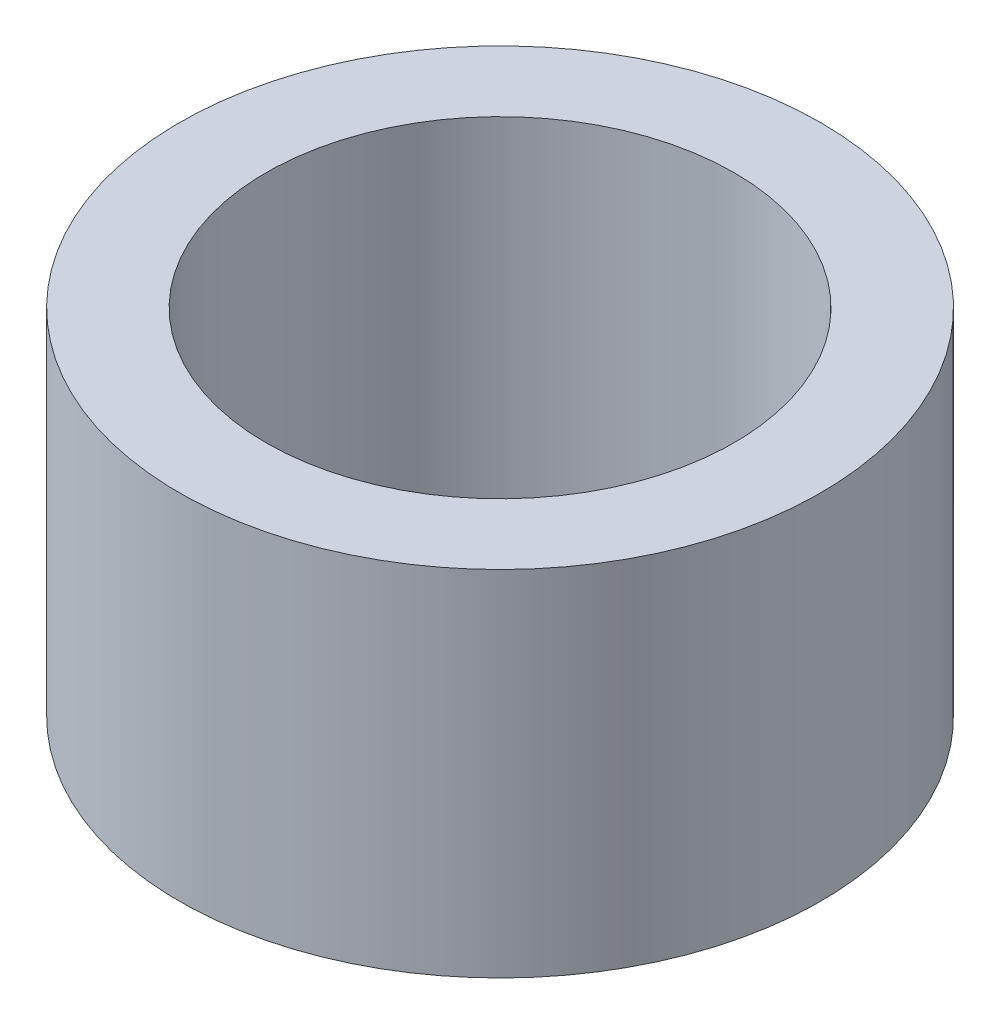
ISO-10303-21;
HEADER;
FILE_DESCRIPTION(('STEP AP214'),'2;1');
FILE_NAME('part.step','',(''),(''),'','','');
FILE_SCHEMA(('AUTOMOTIVE_DESIGN { 1 0 10303 214 1 1 1 1 }'));
ENDSEC;
DATA;
#1=APPLICATION_CONTEXT('core data for automotive mechanical design processes');
#2=APPLICATION_PROTOCOL_DEFINITION('international standard','automotive_design',2000,#1);
#3=PRODUCT_CONTEXT('',#1,'mechanical');
#4=PRODUCT('Part','Part','',(#3));
#5=PRODUCT_RELATED_PRODUCT_CATEGORY('part','',(#4));
#6=PRODUCT_DEFINITION_FORMATION('','',#4);
#7=PRODUCT_DEFINITION_CONTEXT('part definition',#1,'design');
#8=PRODUCT_DEFINITION('design','',#6,#7);
#9=PRODUCT_DEFINITION_SHAPE('','',#8);
#10=(LENGTH_UNIT() NAMED_UNIT(*) SI_UNIT(.MILLI.,.METRE.));
#11=(NAMED_UNIT(*) PLANE_ANGLE_UNIT() SI_UNIT($,.RADIAN.));
#12=(NAMED_UNIT(*) SI_UNIT($,.STERADIAN.) SOLID_ANGLE_UNIT());
#13=UNCERTAINTY_MEASURE_WITH_UNIT(LENGTH_MEASURE(1.E-05),#10,'distance_accuracy_value','');
#14=(GEOMETRIC_REPRESENTATION_CONTEXT(3) GLOBAL_UNCERTAINTY_ASSIGNED_CONTEXT((#13)) GLOBAL_UNIT_ASSIGNED_CONTEXT((#10,
#11,#12)) REPRESENTATION_CONTEXT('',''));
#15=CARTESIAN_POINT('',(0.,0.,0.));
#16=DIRECTION('',(0.,0.,1.));
#17=DIRECTION('',(1.,0.,0.));
#18=AXIS2_PLACEMENT_3D('',#15,#16,#17);
#19=CARTESIAN_POINT('',(0.,4.5593,0.));
#20=DIRECTION('',(0.,1.,0.));
#21=DIRECTION('',(0.,0.,1.));
#22=AXIS2_PLACEMENT_3D('',#19,#20,#21);
#23=PLANE('',#22);
#24=CARTESIAN_POINT('',(0.,4.5593,0.));
#25=DIRECTION('',(0.,1.,0.));
#26=DIRECTION('',(0.,0.,1.));
#27=AXIS2_PLACEMENT_3D('',#24,#25,#26);
#28=CIRCLE('',#27,4.13258);
#29=CARTESIAN_POINT('',(0.,4.5593,-4.13258));
#30=VERTEX_POINT('',#29);
#31=EDGE_CURVE('E10',#30,#30,#28,.T.);
#32=ORIENTED_EDGE('',*,*,#31,.T.);
#33=EDGE_LOOP('',(#32));
#34=FACE_BOUND('',#33,.T.);
#35=CARTESIAN_POINT('',(0.,4.5593,0.));
#36=DIRECTION('',(0.,1.,0.));
#37=DIRECTION('',(0.,0.,1.));
#38=AXIS2_PLACEMENT_3D('',#35,#36,#37);
#39=CIRCLE('',#38,3.01625);
#40=CARTESIAN_POINT('',(0.,4.5593,-3.01625));
#41=VERTEX_POINT('',#40);
#42=EDGE_CURVE('E43',#41,#41,#39,.T.);
#43=ORIENTED_EDGE('',*,*,#42,.F.);
#44=EDGE_LOOP('',(#43));
#45=FACE_BOUND('',#44,.T.);
#46=ADVANCED_FACE('F32',(#34,#45),#23,.T.);
#47=CARTESIAN_POINT('',(0.,0.,0.));
#48=DIRECTION('',(0.,1.,0.));
#49=DIRECTION('',(0.,0.,1.));
#50=AXIS2_PLACEMENT_3D('',#47,#48,#49);
#51=PLANE('',#50);
#52=CARTESIAN_POINT('',(0.,0.,0.));
#53=DIRECTION('',(0.,1.,0.));
#54=DIRECTION('',(0.,0.,1.));
#55=AXIS2_PLACEMENT_3D('',#52,#53,#54);
#56=CIRCLE('',#55,4.13258);
#57=CARTESIAN_POINT('',(0.,0.,-4.13258));
#58=VERTEX_POINT('',#57);
#59=EDGE_CURVE('E36',#58,#58,#56,.T.);
#60=ORIENTED_EDGE('',*,*,#59,.F.);
#61=EDGE_LOOP('',(#60));
#62=FACE_BOUND('',#61,.T.);
#63=CARTESIAN_POINT('',(0.,0.,0.));
#64=DIRECTION('',(0.,1.,0.));
#65=DIRECTION('',(0.,0.,1.));
#66=AXIS2_PLACEMENT_3D('',#63,#64,#65);
#67=CIRCLE('',#66,3.01625);
#68=CARTESIAN_POINT('',(0.,0.,-3.01625));
#69=VERTEX_POINT('',#68);
#70=EDGE_CURVE('E45',#69,#69,#67,.T.);
#71=ORIENTED_EDGE('',*,*,#70,.T.);
#72=EDGE_LOOP('',(#71));
#73=FACE_BOUND('',#72,.T.);
#74=ADVANCED_FACE('F55',(#62,#73),#51,.F.);
#75=CARTESIAN_POINT('',(0.,4.5593,0.));
#76=DIRECTION('',(0.,-1.,0.));
#77=DIRECTION('',(0.,0.,-1.));
#78=AXIS2_PLACEMENT_3D('',#75,#76,#77);
#79=CYLINDRICAL_SURFACE('',#78,4.13258);
#80=CARTESIAN_POINT('',(0.,4.5593,-4.13258));
#81=CARTESIAN_POINT('',(0.,4.51180729166667,-4.13258));
#82=CARTESIAN_POINT('',(0.,4.46431458333333,-4.13258));
#83=CARTESIAN_POINT('',(0.,4.36932916666667,-4.13258));
#84=CARTESIAN_POINT('',(0.,4.32183645833333,-4.13258));
#85=CARTESIAN_POINT('',(0.,4.22685104166667,-4.13258));
#86=CARTESIAN_POINT('',(0.,4.17935833333333,-4.13258));
#87=CARTESIAN_POINT('',(0.,4.08437291666667,-4.13258));
#88=CARTESIAN_POINT('',(0.,4.03688020833333,-4.13258));
#89=CARTESIAN_POINT('',(0.,3.94189479166667,-4.13258));
#90=CARTESIAN_POINT('',(0.,3.89440208333333,-4.13258));
#91=CARTESIAN_POINT('',(0.,3.79941666666667,-4.13258));
#92=CARTESIAN_POINT('',(0.,3.75192395833333,-4.13258));
#93=CARTESIAN_POINT('',(0.,3.65693854166667,-4.13258));
#94=CARTESIAN_POINT('',(0.,3.60944583333333,-4.13258));
#95=CARTESIAN_POINT('',(0.,3.51446041666667,-4.13258));
#96=CARTESIAN_POINT('',(0.,3.46696770833333,-4.13258));
#97=CARTESIAN_POINT('',(0.,3.37198229166667,-4.13258));
#98=CARTESIAN_POINT('',(0.,3.32448958333333,-4.13258));
#99=CARTESIAN_POINT('',(0.,3.22950416666667,-4.13258));
#100=CARTESIAN_POINT('',(0.,3.18201145833333,-4.13258));
#101=CARTESIAN_POINT('',(0.,3.08702604166667,-4.13258));
#102=CARTESIAN_POINT('',(0.,3.03953333333333,-4.13258));
#103=CARTESIAN_POINT('',(0.,2.94454791666667,-4.13258));
#104=CARTESIAN_POINT('',(0.,2.89705520833333,-4.13258));
#105=CARTESIAN_POINT('',(0.,2.80206979166667,-4.13258));
#106=CARTESIAN_POINT('',(0.,2.75457708333333,-4.13258));
#107=CARTESIAN_POINT('',(0.,2.65959166666667,-4.13258));
#108=CARTESIAN_POINT('',(0.,2.61209895833333,-4.13258));
#109=CARTESIAN_POINT('',(0.,2.51711354166667,-4.13258));
#110=CARTESIAN_POINT('',(0.,2.46962083333333,-4.13258));
#111=CARTESIAN_POINT('',(0.,2.37463541666667,-4.13258));
#112=CARTESIAN_POINT('',(0.,2.32714270833333,-4.13258));
#113=CARTESIAN_POINT('',(0.,2.23215729166667,-4.13258));
#114=CARTESIAN_POINT('',(0.,2.18466458333333,-4.13258));
#115=CARTESIAN_POINT('',(0.,2.08967916666667,-4.13258));
#116=CARTESIAN_POINT('',(0.,2.04218645833333,-4.13258));
#117=CARTESIAN_POINT('',(0.,1.94720104166667,-4.13258));
#118=CARTESIAN_POINT('',(0.,1.89970833333333,-4.13258));
#119=CARTESIAN_POINT('',(0.,1.80472291666667,-4.13258));
#120=CARTESIAN_POINT('',(0.,1.75723020833333,-4.13258));
#121=CARTESIAN_POINT('',(0.,1.66224479166667,-4.13258));
#122=CARTESIAN_POINT('',(0.,1.61475208333333,-4.13258));
#123=CARTESIAN_POINT('',(0.,1.51976666666667,-4.13258));
#124=CARTESIAN_POINT('',(0.,1.47227395833333,-4.13258));
#125=CARTESIAN_POINT('',(0.,1.37728854166667,-4.13258));
#126=CARTESIAN_POINT('',(0.,1.32979583333333,-4.13258));
#127=CARTESIAN_POINT('',(0.,1.23481041666667,-4.13258));
#128=CARTESIAN_POINT('',(0.,1.18731770833333,-4.13258));
#129=CARTESIAN_POINT('',(0.,1.09233229166667,-4.13258));
#130=CARTESIAN_POINT('',(0.,1.04483958333333,-4.13258));
#131=CARTESIAN_POINT('',(0.,0.949854166666666,-4.13258));
#132=CARTESIAN_POINT('',(0.,0.902361458333332,-4.13258));
#133=CARTESIAN_POINT('',(0.,0.807376041666666,-4.13258));
#134=CARTESIAN_POINT('',(0.,0.759883333333332,-4.13258));
#135=CARTESIAN_POINT('',(0.,0.664897916666666,-4.13258));
#136=CARTESIAN_POINT('',(0.,0.617405208333333,-4.13258));
#137=CARTESIAN_POINT('',(0.,0.522419791666667,-4.13258));
#138=CARTESIAN_POINT('',(0.,0.474927083333333,-4.13258));
#139=CARTESIAN_POINT('',(0.,0.379941666666667,-4.13258));
#140=CARTESIAN_POINT('',(0.,0.332448958333333,-4.13258));
#141=CARTESIAN_POINT('',(0.,0.237463541666667,-4.13258));
#142=CARTESIAN_POINT('',(0.,0.189970833333333,-4.13258));
#143=CARTESIAN_POINT('',(0.,0.0949854166666664,-4.13258));
#144=CARTESIAN_POINT('',(0.,0.0474927083333332,-4.13258));
#145=CARTESIAN_POINT('',(0.,0.,-4.13258));
#146=B_SPLINE_CURVE_WITH_KNOTS('',3,(#80,#81,#82,#83,#84,#85,#86,#87,#88,#89,#90,#91,#92,#93,
#94,#95,#96,#97,#98,#99,#100,#101,#102,#103,#104,#105,#106,#107,#108,#109,#110,#111,#112,#113,
#114,#115,#116,#117,#118,#119,#120,#121,#122,#123,#124,#125,#126,#127,#128,#129,#130,#131,#132,
#133,#134,#135,#136,#137,#138,#139,#140,#141,#142,#143,#144,#145),.UNSPECIFIED.,.F.,.F.,(4,2,2,
2,2,2,2,2,2,2,2,2,2,2,2,2,2,2,2,2,2,2,2,2,2,2,2,2,2,2,2,2,4),(0.,0.142478125000001,0.28495625,
0.427434375000001,0.5699125,0.712390625,0.85486875,0.997346875,1.139825,1.282303125,1.42478125,
1.567259375,1.7097375,1.852215625,1.99469375,2.137171875,2.27965,2.422128125,2.56460625,
2.707084375,2.8495625,2.992040625,3.13451875,3.276996875,3.419475,3.561953125,3.70443125,
3.846909375,3.9893875,4.131865625,4.27434375,4.416821875,4.5593),.UNSPECIFIED.);
#147=EDGE_CURVE('BSEAM34',#30,#58,#146,.T.);
#148=ORIENTED_EDGE('',*,*,#31,.F.);
#149=ORIENTED_EDGE('',*,*,#59,.T.);
#150=ORIENTED_EDGE('',*,*,#147,.T.);
#151=ORIENTED_EDGE('',*,*,#147,.F.);
#152=EDGE_LOOP('',(#148,#150,#149,#151));
#153=FACE_BOUND('',#152,.T.);
#154=ADVANCED_FACE('F34',(#153),#79,.T.);
#155=CARTESIAN_POINT('',(0.,4.5593,0.));
#156=DIRECTION('',(0.,-1.,0.));
#157=DIRECTION('',(0.,0.,-1.));
#158=AXIS2_PLACEMENT_3D('',#155,#156,#157);
#159=CYLINDRICAL_SURFACE('',#158,3.01625);
#160=CARTESIAN_POINT('',(0.,4.5593,-3.01625));
#161=CARTESIAN_POINT('',(0.,4.51180729166667,-3.01625));
#162=CARTESIAN_POINT('',(0.,4.46431458333333,-3.01625));
#163=CARTESIAN_POINT('',(0.,4.36932916666667,-3.01625));
#164=CARTESIAN_POINT('',(0.,4.32183645833333,-3.01625));
#165=CARTESIAN_POINT('',(0.,4.22685104166667,-3.01625));
#166=CARTESIAN_POINT('',(0.,4.17935833333333,-3.01625));
#167=CARTESIAN_POINT('',(0.,4.08437291666667,-3.01625));
#168=CARTESIAN_POINT('',(0.,4.03688020833333,-3.01625));
#169=CARTESIAN_POINT('',(0.,3.94189479166667,-3.01625));
#170=CARTESIAN_POINT('',(0.,3.89440208333333,-3.01625));
#171=CARTESIAN_POINT('',(0.,3.79941666666667,-3.01625));
#172=CARTESIAN_POINT('',(0.,3.75192395833333,-3.01625));
#173=CARTESIAN_POINT('',(0.,3.65693854166667,-3.01625));
#174=CARTESIAN_POINT('',(0.,3.60944583333333,-3.01625));
#175=CARTESIAN_POINT('',(0.,3.51446041666667,-3.01625));
#176=CARTESIAN_POINT('',(0.,3.46696770833333,-3.01625));
#177=CARTESIAN_POINT('',(0.,3.37198229166667,-3.01625));
#178=CARTESIAN_POINT('',(0.,3.32448958333333,-3.01625));
#179=CARTESIAN_POINT('',(0.,3.22950416666667,-3.01625));
#180=CARTESIAN_POINT('',(0.,3.18201145833333,-3.01625));
#181=CARTESIAN_POINT('',(0.,3.08702604166667,-3.01625));
#182=CARTESIAN_POINT('',(0.,3.03953333333333,-3.01625));
#183=CARTESIAN_POINT('',(0.,2.94454791666667,-3.01625));
#184=CARTESIAN_POINT('',(0.,2.89705520833333,-3.01625));
#185=CARTESIAN_POINT('',(0.,2.80206979166667,-3.01625));
#186=CARTESIAN_POINT('',(0.,2.75457708333333,-3.01625));
#187=CARTESIAN_POINT('',(0.,2.65959166666667,-3.01625));
#188=CARTESIAN_POINT('',(0.,2.61209895833333,-3.01625));
#189=CARTESIAN_POINT('',(0.,2.51711354166667,-3.01625));
#190=CARTESIAN_POINT('',(0.,2.46962083333333,-3.01625));
#191=CARTESIAN_POINT('',(0.,2.37463541666667,-3.01625));
#192=CARTESIAN_POINT('',(0.,2.32714270833333,-3.01625));
#193=CARTESIAN_POINT('',(0.,2.23215729166667,-3.01625));
#194=CARTESIAN_POINT('',(0.,2.18466458333333,-3.01625));
#195=CARTESIAN_POINT('',(0.,2.08967916666667,-3.01625));
#196=CARTESIAN_POINT('',(0.,2.04218645833333,-3.01625));
#197=CARTESIAN_POINT('',(0.,1.94720104166667,-3.01625));
#198=CARTESIAN_POINT('',(0.,1.89970833333333,-3.01625));
#199=CARTESIAN_POINT('',(0.,1.80472291666667,-3.01625));
#200=CARTESIAN_POINT('',(0.,1.75723020833333,-3.01625));
#201=CARTESIAN_POINT('',(0.,1.66224479166667,-3.01625));
#202=CARTESIAN_POINT('',(0.,1.61475208333333,-3.01625));
#203=CARTESIAN_POINT('',(0.,1.51976666666667,-3.01625));
#204=CARTESIAN_POINT('',(0.,1.47227395833333,-3.01625));
#205=CARTESIAN_POINT('',(0.,1.37728854166667,-3.01625));
#206=CARTESIAN_POINT('',(0.,1.32979583333333,-3.01625));
#207=CARTESIAN_POINT('',(0.,1.23481041666667,-3.01625));
#208=CARTESIAN_POINT('',(0.,1.18731770833333,-3.01625));
#209=CARTESIAN_POINT('',(0.,1.09233229166667,-3.01625));
#210=CARTESIAN_POINT('',(0.,1.04483958333333,-3.01625));
#211=CARTESIAN_POINT('',(0.,0.949854166666667,-3.01625));
#212=CARTESIAN_POINT('',(0.,0.902361458333333,-3.01625));
#213=CARTESIAN_POINT('',(0.,0.807376041666667,-3.01625));
#214=CARTESIAN_POINT('',(0.,0.759883333333333,-3.01625));
#215=CARTESIAN_POINT('',(0.,0.664897916666667,-3.01625));
#216=CARTESIAN_POINT('',(0.,0.617405208333333,-3.01625));
#217=CARTESIAN_POINT('',(0.,0.522419791666667,-3.01625));
#218=CARTESIAN_POINT('',(0.,0.474927083333333,-3.01625));
#219=CARTESIAN_POINT('',(0.,0.379941666666667,-3.01625));
#220=CARTESIAN_POINT('',(0.,0.332448958333333,-3.01625));
#221=CARTESIAN_POINT('',(0.,0.237463541666667,-3.01625));
#222=CARTESIAN_POINT('',(0.,0.189970833333333,-3.01625));
#223=CARTESIAN_POINT('',(0.,0.0949854166666664,-3.01625));
#224=CARTESIAN_POINT('',(0.,0.0474927083333332,-3.01625));
#225=CARTESIAN_POINT('',(0.,0.,-3.01625));
#226=B_SPLINE_CURVE_WITH_KNOTS('',3,(#160,#161,#162,#163,#164,#165,#166,#167,#168,#169,#170,
#171,#172,#173,#174,#175,#176,#177,#178,#179,#180,#181,#182,#183,#184,#185,#186,#187,#188,#189,
#190,#191,#192,#193,#194,#195,#196,#197,#198,#199,#200,#201,#202,#203,#204,#205,#206,#207,#208,
#209,#210,#211,#212,#213,#214,#215,#216,#217,#218,#219,#220,#221,#222,#223,#224,#225),
.UNSPECIFIED.,.F.,.F.,(4,2,2,2,2,2,2,2,2,2,2,2,2,2,2,2,2,2,2,2,2,2,2,2,2,2,2,2,2,2,2,2,4),(0.,
0.142478125,0.284956249999999,0.427434375,0.569912499999999,0.712390624999999,0.85486875,
0.997346874999999,1.139825,1.282303125,1.42478125,1.567259375,1.7097375,1.852215625,1.99469375,
2.137171875,2.27965,2.422128125,2.56460625,2.707084375,2.8495625,2.992040625,3.13451875,
3.276996875,3.419475,3.561953125,3.70443125,3.846909375,3.9893875,4.131865625,4.27434375,
4.416821875,4.5593),.UNSPECIFIED.);
#227=EDGE_CURVE('BSEAM51',#41,#69,#226,.T.);
#228=ORIENTED_EDGE('',*,*,#42,.T.);
#229=ORIENTED_EDGE('',*,*,#70,.F.);
#230=ORIENTED_EDGE('',*,*,#227,.T.);
#231=ORIENTED_EDGE('',*,*,#227,.F.);
#232=EDGE_LOOP('',(#228,#230,#229,#231));
#233=FACE_BOUND('',#232,.T.);
#234=ADVANCED_FACE('F51',(#233),#159,.F.);
#235=CLOSED_SHELL('',(#46,#74,#154,#234));
#236=MANIFOLD_SOLID_BREP('B2',#235);
#237=ADVANCED_BREP_SHAPE_REPRESENTATION('',(#18,#236),#14);
#238=SHAPE_DEFINITION_REPRESENTATION(#9,#237);
ENDSEC;
END-ISO-10303-21;
